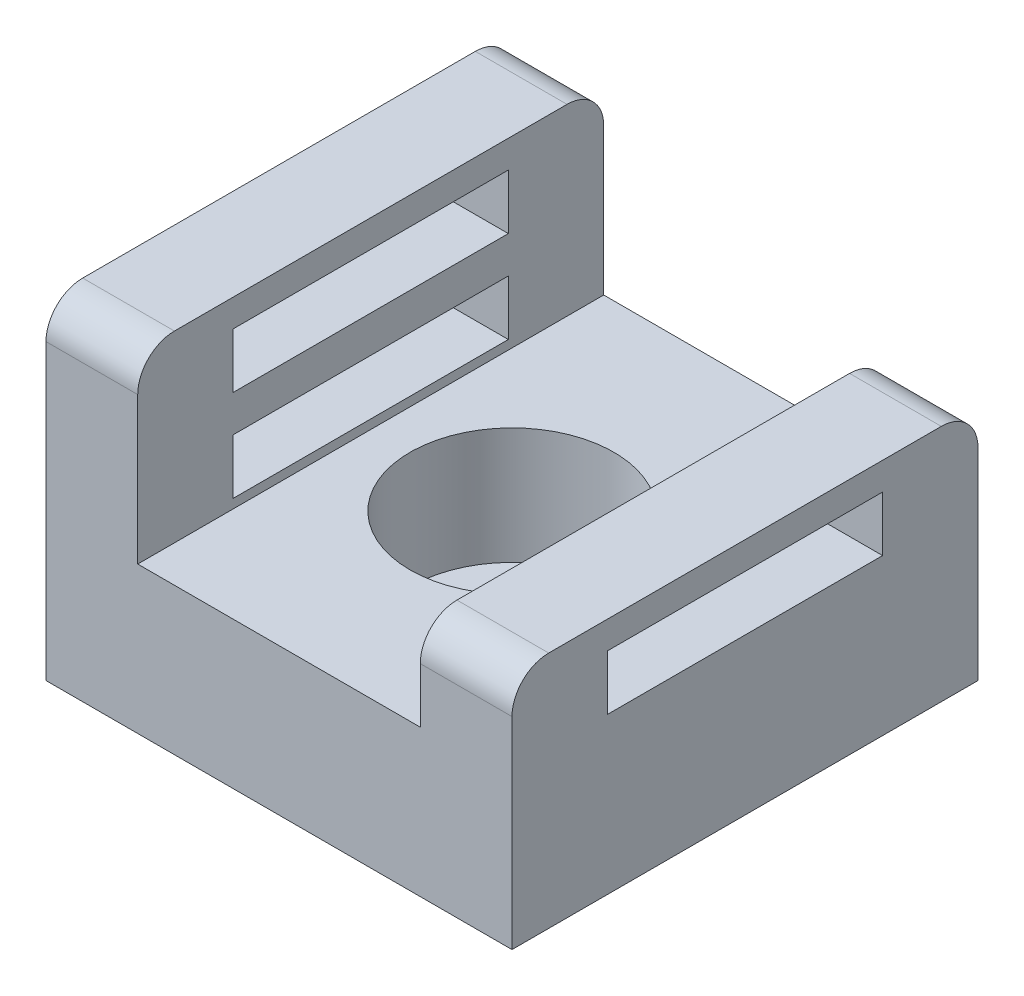
ISO-10303-21;
HEADER;
FILE_DESCRIPTION(('STEP AP214'),'2;1');
FILE_NAME('part.step','',(''),(''),'','','');
FILE_SCHEMA(('AUTOMOTIVE_DESIGN { 1 0 10303 214 1 1 1 1 }'));
ENDSEC;
DATA;
#1=APPLICATION_CONTEXT('core data for automotive mechanical design processes');
#2=APPLICATION_PROTOCOL_DEFINITION('international standard','automotive_design',2000,#1);
#3=PRODUCT_CONTEXT('',#1,'mechanical');
#4=PRODUCT('Part','Part','',(#3));
#5=PRODUCT_RELATED_PRODUCT_CATEGORY('part','',(#4));
#6=PRODUCT_DEFINITION_FORMATION('','',#4);
#7=PRODUCT_DEFINITION_CONTEXT('part definition',#1,'design');
#8=PRODUCT_DEFINITION('design','',#6,#7);
#9=PRODUCT_DEFINITION_SHAPE('','',#8);
#10=(LENGTH_UNIT() NAMED_UNIT(*) SI_UNIT(.MILLI.,.METRE.));
#11=(NAMED_UNIT(*) PLANE_ANGLE_UNIT() SI_UNIT($,.RADIAN.));
#12=(NAMED_UNIT(*) SI_UNIT($,.STERADIAN.) SOLID_ANGLE_UNIT());
#13=UNCERTAINTY_MEASURE_WITH_UNIT(LENGTH_MEASURE(1.E-05),#10,'distance_accuracy_value','');
#14=(GEOMETRIC_REPRESENTATION_CONTEXT(3) GLOBAL_UNCERTAINTY_ASSIGNED_CONTEXT((#13)) GLOBAL_UNIT_ASSIGNED_CONTEXT((#10,
#11,#12)) REPRESENTATION_CONTEXT('',''));
#15=CARTESIAN_POINT('',(0.,0.,0.));
#16=DIRECTION('',(0.,0.,1.));
#17=DIRECTION('',(1.,0.,0.));
#18=AXIS2_PLACEMENT_3D('',#15,#16,#17);
#19=CARTESIAN_POINT('',(0.,8.,0.));
#20=DIRECTION('',(0.,1.,0.));
#21=DIRECTION('',(0.,0.,1.));
#22=AXIS2_PLACEMENT_3D('',#19,#20,#21);
#23=PLANE('',#22);
#24=CARTESIAN_POINT('',(2.02813688212928,8.,7.89524714828898));
#25=DIRECTION('',(0.,1.,0.));
#26=DIRECTION('',(0.,0.,1.));
#27=AXIS2_PLACEMENT_3D('',#24,#25,#26);
#28=CIRCLE('',#27,5.55625);
#29=CARTESIAN_POINT('',(2.02813688212928,8.,13.451497148289));
#30=VERTEX_POINT('',#29);
#31=EDGE_CURVE('E285',#30,#30,#28,.T.);
#32=ORIENTED_EDGE('',*,*,#31,.F.);
#33=EDGE_LOOP('',(#32));
#34=FACE_BOUND('',#33,.T.);
#35=DIRECTION('',(1.,0.,0.));
#36=VECTOR('',#35,1.);
#37=CARTESIAN_POINT('',(-10.6718631178707,8.,20.595247148289));
#38=LINE('',#37,#36);
#39=CARTESIAN_POINT('',(-5.67186311787072,8.,20.595247148289));
#40=VERTEX_POINT('',#39);
#41=CARTESIAN_POINT('',(9.72813688212928,8.,20.595247148289));
#42=VERTEX_POINT('',#41);
#43=EDGE_CURVE('E317',#40,#42,#38,.T.);
#44=ORIENTED_EDGE('',*,*,#43,.T.);
#45=DIRECTION('',(0.,0.,1.));
#46=VECTOR('',#45,1.);
#47=CARTESIAN_POINT('',(9.72813688212927,8.,-4.80475285171102));
#48=LINE('',#47,#46);
#49=CARTESIAN_POINT('',(9.72813688212928,8.,-4.80475285171102));
#50=VERTEX_POINT('',#49);
#51=EDGE_CURVE('E297',#50,#42,#48,.T.);
#52=ORIENTED_EDGE('',*,*,#51,.F.);
#53=DIRECTION('',(-1.,0.,0.));
#54=VECTOR('',#53,1.);
#55=CARTESIAN_POINT('',(-10.6718631178707,8.,-4.80475285171102));
#56=LINE('',#55,#54);
#57=CARTESIAN_POINT('',(-5.67186311787072,8.,-4.80475285171102));
#58=VERTEX_POINT('',#57);
#59=EDGE_CURVE('E320',#50,#58,#56,.T.);
#60=ORIENTED_EDGE('',*,*,#59,.T.);
#61=DIRECTION('',(0.,0.,-1.));
#62=VECTOR('',#61,1.);
#63=CARTESIAN_POINT('',(-5.67186311787072,8.,-4.80475285171102));
#64=LINE('',#63,#62);
#65=EDGE_CURVE('E309',#40,#58,#64,.T.);
#66=ORIENTED_EDGE('',*,*,#65,.F.);
#67=EDGE_LOOP('',(#44,#52,#60,#66));
#68=FACE_BOUND('',#67,.T.);
#69=ADVANCED_FACE('F33',(#34,#68),#23,.T.);
#70=CARTESIAN_POINT('',(-10.6718631178707,8.,-4.80475285171102));
#71=DIRECTION('',(1.,0.,0.));
#72=DIRECTION('',(0.,0.,-1.));
#73=AXIS2_PLACEMENT_3D('',#70,#71,#72);
#74=PLANE('',#73);
#75=DIRECTION('',(0.,0.,1.));
#76=VECTOR('',#75,1.);
#77=CARTESIAN_POINT('',(-10.6718631178707,13.5,0.395247148288981));
#78=LINE('',#77,#76);
#79=CARTESIAN_POINT('',(-10.6718631178707,13.5,0.395247148288978));
#80=VERTEX_POINT('',#79);
#81=CARTESIAN_POINT('',(-10.6718631178707,13.5,15.395247148289));
#82=VERTEX_POINT('',#81);
#83=EDGE_CURVE('E210',#80,#82,#78,.T.);
#84=ORIENTED_EDGE('',*,*,#83,.F.);
#85=DIRECTION('',(0.,-1.,0.));
#86=VECTOR('',#85,1.);
#87=CARTESIAN_POINT('',(-10.6718631178707,16.5,0.395247148288981));
#88=LINE('',#87,#86);
#89=CARTESIAN_POINT('',(-10.6718631178707,16.5,0.395247148288981));
#90=VERTEX_POINT('',#89);
#91=EDGE_CURVE('E215',#90,#80,#88,.T.);
#92=ORIENTED_EDGE('',*,*,#91,.F.);
#93=DIRECTION('',(0.,0.,-1.));
#94=VECTOR('',#93,1.);
#95=CARTESIAN_POINT('',(-10.6718631178707,16.5,0.395247148288981));
#96=LINE('',#95,#94);
#97=CARTESIAN_POINT('',(-10.6718631178707,16.5,15.395247148289));
#98=VERTEX_POINT('',#97);
#99=EDGE_CURVE('E220',#98,#90,#96,.T.);
#100=ORIENTED_EDGE('',*,*,#99,.F.);
#101=DIRECTION('',(0.,1.,0.));
#102=VECTOR('',#101,1.);
#103=CARTESIAN_POINT('',(-10.6718631178707,16.5,15.395247148289));
#104=LINE('',#103,#102);
#105=EDGE_CURVE('E199',#82,#98,#104,.T.);
#106=ORIENTED_EDGE('',*,*,#105,.F.);
#107=EDGE_LOOP('',(#84,#92,#100,#106));
#108=FACE_BOUND('',#107,.T.);
#109=DIRECTION('',(0.,0.,1.));
#110=VECTOR('',#109,1.);
#111=CARTESIAN_POINT('',(-10.6718631178707,8.5,15.395247148289));
#112=LINE('',#111,#110);
#113=CARTESIAN_POINT('',(-10.6718631178707,8.5,0.395247148288972));
#114=VERTEX_POINT('',#113);
#115=CARTESIAN_POINT('',(-10.6718631178707,8.5,15.395247148289));
#116=VERTEX_POINT('',#115);
#117=EDGE_CURVE('E251',#114,#116,#112,.T.);
#118=ORIENTED_EDGE('',*,*,#117,.F.);
#119=DIRECTION('',(0.,-1.,0.));
#120=VECTOR('',#119,1.);
#121=CARTESIAN_POINT('',(-10.6718631178707,8.5,0.395247148288976));
#122=LINE('',#121,#120);
#123=CARTESIAN_POINT('',(-10.6718631178707,11.5,0.395247148288976));
#124=VERTEX_POINT('',#123);
#125=EDGE_CURVE('E235',#124,#114,#122,.T.);
#126=ORIENTED_EDGE('',*,*,#125,.F.);
#127=DIRECTION('',(0.,0.,-1.));
#128=VECTOR('',#127,1.);
#129=CARTESIAN_POINT('',(-10.6718631178707,11.5,15.395247148289));
#130=LINE('',#129,#128);
#131=CARTESIAN_POINT('',(-10.6718631178707,11.5,15.395247148289));
#132=VERTEX_POINT('',#131);
#133=EDGE_CURVE('E240',#132,#124,#130,.T.);
#134=ORIENTED_EDGE('',*,*,#133,.F.);
#135=DIRECTION('',(0.,1.,0.));
#136=VECTOR('',#135,1.);
#137=CARTESIAN_POINT('',(-10.6718631178707,8.5,15.395247148289));
#138=LINE('',#137,#136);
#139=EDGE_CURVE('E254',#116,#132,#138,.T.);
#140=ORIENTED_EDGE('',*,*,#139,.F.);
#141=EDGE_LOOP('',(#118,#126,#134,#140));
#142=FACE_BOUND('',#141,.T.);
#143=DIRECTION('',(0.,0.,1.));
#144=VECTOR('',#143,1.);
#145=CARTESIAN_POINT('',(-10.6718631178707,18.,20.595247148289));
#146=LINE('',#145,#144);
#147=CARTESIAN_POINT('',(-10.6718631178707,18.,-2.80475285171102));
#148=VERTEX_POINT('',#147);
#149=CARTESIAN_POINT('',(-10.6718631178707,18.,18.595247148289));
#150=VERTEX_POINT('',#149);
#151=EDGE_CURVE('E232',#148,#150,#146,.T.);
#152=ORIENTED_EDGE('',*,*,#151,.F.);
#153=CARTESIAN_POINT('',(-10.6718631178707,16.,-2.80475285171102));
#154=DIRECTION('',(1.,0.,0.));
#155=DIRECTION('',(0.,0.,-1.));
#156=AXIS2_PLACEMENT_3D('',#153,#154,#155);
#157=CIRCLE('',#156,2.);
#158=CARTESIAN_POINT('',(-10.6718631178707,16.,-4.80475285171102));
#159=VERTEX_POINT('',#158);
#160=EDGE_CURVE('E371',#148,#159,#157,.F.);
#161=ORIENTED_EDGE('',*,*,#160,.T.);
#162=DIRECTION('',(0.,-1.,0.));
#163=VECTOR('',#162,1.);
#164=CARTESIAN_POINT('',(-10.6718631178707,8.,-4.80475285171102));
#165=LINE('',#164,#163);
#166=CARTESIAN_POINT('',(-10.6718631178707,0.,-4.80475285171102));
#167=VERTEX_POINT('',#166);
#168=EDGE_CURVE('E324',#159,#167,#165,.T.);
#169=ORIENTED_EDGE('',*,*,#168,.T.);
#170=DIRECTION('',(0.,0.,1.));
#171=VECTOR('',#170,1.);
#172=CARTESIAN_POINT('',(-10.6718631178707,0.,-4.80475285171102));
#173=LINE('',#172,#171);
#174=CARTESIAN_POINT('',(-10.6718631178707,0.,20.595247148289));
#175=VERTEX_POINT('',#174);
#176=EDGE_CURVE('E316',#167,#175,#173,.T.);
#177=ORIENTED_EDGE('',*,*,#176,.T.);
#178=DIRECTION('',(0.,-1.,0.));
#179=VECTOR('',#178,1.);
#180=CARTESIAN_POINT('',(-10.6718631178707,8.,20.595247148289));
#181=LINE('',#180,#179);
#182=CARTESIAN_POINT('',(-10.6718631178707,16.,20.595247148289));
#183=VERTEX_POINT('',#182);
#184=EDGE_CURVE('E340',#183,#175,#181,.T.);
#185=ORIENTED_EDGE('',*,*,#184,.F.);
#186=CARTESIAN_POINT('',(-10.6718631178707,16.,18.595247148289));
#187=DIRECTION('',(1.,0.,0.));
#188=DIRECTION('',(0.,0.,-1.));
#189=AXIS2_PLACEMENT_3D('',#186,#187,#188);
#190=CIRCLE('',#189,2.);
#191=EDGE_CURVE('E369',#183,#150,#190,.F.);
#192=ORIENTED_EDGE('',*,*,#191,.T.);
#193=EDGE_LOOP('',(#152,#161,#169,#177,#185,#192));
#194=FACE_BOUND('',#193,.T.);
#195=ADVANCED_FACE('F217',(#108,#142,#194),#74,.F.);
#196=CARTESIAN_POINT('',(-10.6718631178707,8.,20.595247148289));
#197=DIRECTION('',(0.,0.,-1.));
#198=DIRECTION('',(-1.,0.,0.));
#199=AXIS2_PLACEMENT_3D('',#196,#197,#198);
#200=PLANE('',#199);
#201=DIRECTION('',(0.,-1.,0.));
#202=VECTOR('',#201,1.);
#203=CARTESIAN_POINT('',(-5.67186311787072,13.,20.595247148289));
#204=LINE('',#203,#202);
#205=CARTESIAN_POINT('',(-5.67186311787072,16.,20.595247148289));
#206=VERTEX_POINT('',#205);
#207=EDGE_CURVE('E314',#206,#40,#204,.T.);
#208=ORIENTED_EDGE('',*,*,#207,.F.);
#209=DIRECTION('',(1.,0.,0.));
#210=VECTOR('',#209,1.);
#211=CARTESIAN_POINT('',(-10.6718631178707,16.,20.595247148289));
#212=LINE('',#211,#210);
#213=EDGE_CURVE('E383',#206,#183,#212,.F.);
#214=ORIENTED_EDGE('',*,*,#213,.T.);
#215=ORIENTED_EDGE('',*,*,#184,.T.);
#216=DIRECTION('',(1.,0.,0.));
#217=VECTOR('',#216,1.);
#218=CARTESIAN_POINT('',(-10.6718631178707,0.,20.595247148289));
#219=LINE('',#218,#217);
#220=CARTESIAN_POINT('',(14.7281368821293,0.,20.595247148289));
#221=VERTEX_POINT('',#220);
#222=EDGE_CURVE('E327',#175,#221,#219,.T.);
#223=ORIENTED_EDGE('',*,*,#222,.T.);
#224=DIRECTION('',(0.,-1.,0.));
#225=VECTOR('',#224,1.);
#226=CARTESIAN_POINT('',(14.7281368821293,8.,20.595247148289));
#227=LINE('',#226,#225);
#228=CARTESIAN_POINT('',(14.7281368821293,11.,20.595247148289));
#229=VERTEX_POINT('',#228);
#230=EDGE_CURVE('E338',#229,#221,#227,.T.);
#231=ORIENTED_EDGE('',*,*,#230,.F.);
#232=DIRECTION('',(1.,0.,0.));
#233=VECTOR('',#232,1.);
#234=CARTESIAN_POINT('',(-10.6718631178707,11.,20.595247148289));
#235=LINE('',#234,#233);
#236=CARTESIAN_POINT('',(9.72813688212928,11.,20.595247148289));
#237=VERTEX_POINT('',#236);
#238=EDGE_CURVE('E381',#229,#237,#235,.F.);
#239=ORIENTED_EDGE('',*,*,#238,.T.);
#240=DIRECTION('',(0.,-1.,0.));
#241=VECTOR('',#240,1.);
#242=CARTESIAN_POINT('',(9.72813688212928,13.,20.595247148289));
#243=LINE('',#242,#241);
#244=EDGE_CURVE('E303',#237,#42,#243,.T.);
#245=ORIENTED_EDGE('',*,*,#244,.T.);
#246=ORIENTED_EDGE('',*,*,#43,.F.);
#247=EDGE_LOOP('',(#208,#214,#215,#223,#231,#239,#245,#246));
#248=FACE_BOUND('',#247,.T.);
#249=ADVANCED_FACE('F414',(#248),#200,.F.);
#250=CARTESIAN_POINT('',(14.7281368821293,8.,-4.80475285171102));
#251=DIRECTION('',(-1.,0.,0.));
#252=DIRECTION('',(0.,0.,1.));
#253=AXIS2_PLACEMENT_3D('',#250,#251,#252);
#254=PLANE('',#253);
#255=DIRECTION('',(0.,0.,-1.));
#256=VECTOR('',#255,1.);
#257=CARTESIAN_POINT('',(14.7281368821293,11.5,15.395247148289));
#258=LINE('',#257,#256);
#259=CARTESIAN_POINT('',(14.7281368821293,11.5,15.395247148289));
#260=VERTEX_POINT('',#259);
#261=CARTESIAN_POINT('',(14.7281368821293,11.5,0.395247148288972));
#262=VERTEX_POINT('',#261);
#263=EDGE_CURVE('E246',#260,#262,#258,.T.);
#264=ORIENTED_EDGE('',*,*,#263,.T.);
#265=DIRECTION('',(0.,-1.,0.));
#266=VECTOR('',#265,1.);
#267=CARTESIAN_POINT('',(14.7281368821293,8.5,0.395247148288972));
#268=LINE('',#267,#266);
#269=CARTESIAN_POINT('',(14.7281368821293,8.5,0.395247148288972));
#270=VERTEX_POINT('',#269);
#271=EDGE_CURVE('E236',#262,#270,#268,.T.);
#272=ORIENTED_EDGE('',*,*,#271,.T.);
#273=DIRECTION('',(0.,0.,1.));
#274=VECTOR('',#273,1.);
#275=CARTESIAN_POINT('',(14.7281368821293,8.5,15.395247148289));
#276=LINE('',#275,#274);
#277=CARTESIAN_POINT('',(14.7281368821293,8.5,15.395247148289));
#278=VERTEX_POINT('',#277);
#279=EDGE_CURVE('E239',#270,#278,#276,.T.);
#280=ORIENTED_EDGE('',*,*,#279,.T.);
#281=DIRECTION('',(0.,1.,0.));
#282=VECTOR('',#281,1.);
#283=CARTESIAN_POINT('',(14.7281368821293,8.5,15.395247148289));
#284=LINE('',#283,#282);
#285=EDGE_CURVE('E243',#278,#260,#284,.T.);
#286=ORIENTED_EDGE('',*,*,#285,.T.);
#287=EDGE_LOOP('',(#264,#272,#280,#286));
#288=FACE_BOUND('',#287,.T.);
#289=DIRECTION('',(0.,0.,-1.));
#290=VECTOR('',#289,1.);
#291=CARTESIAN_POINT('',(14.7281368821293,13.,-4.80475285171102));
#292=LINE('',#291,#290);
#293=CARTESIAN_POINT('',(14.7281368821293,13.,18.595247148289));
#294=VERTEX_POINT('',#293);
#295=CARTESIAN_POINT('',(14.7281368821293,13.,-2.80475285171102));
#296=VERTEX_POINT('',#295);
#297=EDGE_CURVE('E298',#294,#296,#292,.T.);
#298=ORIENTED_EDGE('',*,*,#297,.F.);
#299=CARTESIAN_POINT('',(14.7281368821293,11.,18.595247148289));
#300=DIRECTION('',(-1.,0.,0.));
#301=DIRECTION('',(0.,0.,1.));
#302=AXIS2_PLACEMENT_3D('',#299,#300,#301);
#303=CIRCLE('',#302,2.);
#304=EDGE_CURVE('E392',#294,#229,#303,.F.);
#305=ORIENTED_EDGE('',*,*,#304,.T.);
#306=ORIENTED_EDGE('',*,*,#230,.T.);
#307=DIRECTION('',(0.,0.,-1.));
#308=VECTOR('',#307,1.);
#309=CARTESIAN_POINT('',(14.7281368821293,0.,-4.80475285171102));
#310=LINE('',#309,#308);
#311=CARTESIAN_POINT('',(14.7281368821293,0.,-4.80475285171102));
#312=VERTEX_POINT('',#311);
#313=EDGE_CURVE('E330',#221,#312,#310,.T.);
#314=ORIENTED_EDGE('',*,*,#313,.T.);
#315=DIRECTION('',(0.,-1.,0.));
#316=VECTOR('',#315,1.);
#317=CARTESIAN_POINT('',(14.7281368821293,8.,-4.80475285171102));
#318=LINE('',#317,#316);
#319=CARTESIAN_POINT('',(14.7281368821293,11.,-4.80475285171102));
#320=VERTEX_POINT('',#319);
#321=EDGE_CURVE('E336',#320,#312,#318,.T.);
#322=ORIENTED_EDGE('',*,*,#321,.F.);
#323=CARTESIAN_POINT('',(14.7281368821293,11.,-2.80475285171102));
#324=DIRECTION('',(-1.,0.,0.));
#325=DIRECTION('',(0.,0.,1.));
#326=AXIS2_PLACEMENT_3D('',#323,#324,#325);
#327=CIRCLE('',#326,2.);
#328=EDGE_CURVE('E390',#320,#296,#327,.F.);
#329=ORIENTED_EDGE('',*,*,#328,.T.);
#330=EDGE_LOOP('',(#298,#305,#306,#314,#322,#329));
#331=FACE_BOUND('',#330,.T.);
#332=ADVANCED_FACE('F404',(#288,#331),#254,.F.);
#333=CARTESIAN_POINT('',(-10.6718631178707,8.,-4.80475285171102));
#334=DIRECTION('',(0.,0.,1.));
#335=DIRECTION('',(1.,0.,0.));
#336=AXIS2_PLACEMENT_3D('',#333,#334,#335);
#337=PLANE('',#336);
#338=ORIENTED_EDGE('',*,*,#168,.F.);
#339=DIRECTION('',(-1.,0.,0.));
#340=VECTOR('',#339,1.);
#341=CARTESIAN_POINT('',(-5.67186311787072,16.,-4.80475285171102));
#342=LINE('',#341,#340);
#343=CARTESIAN_POINT('',(-5.67186311787072,16.,-4.80475285171102));
#344=VERTEX_POINT('',#343);
#345=EDGE_CURVE('E375',#159,#344,#342,.F.);
#346=ORIENTED_EDGE('',*,*,#345,.T.);
#347=DIRECTION('',(0.,-1.,0.));
#348=VECTOR('',#347,1.);
#349=CARTESIAN_POINT('',(-5.67186311787072,13.,-4.80475285171102));
#350=LINE('',#349,#348);
#351=EDGE_CURVE('E312',#344,#58,#350,.T.);
#352=ORIENTED_EDGE('',*,*,#351,.T.);
#353=ORIENTED_EDGE('',*,*,#59,.F.);
#354=DIRECTION('',(0.,-1.,0.));
#355=VECTOR('',#354,1.);
#356=CARTESIAN_POINT('',(9.72813688212927,13.,-4.80475285171102));
#357=LINE('',#356,#355);
#358=CARTESIAN_POINT('',(9.72813688212927,11.,-4.80475285171102));
#359=VERTEX_POINT('',#358);
#360=EDGE_CURVE('E307',#359,#50,#357,.T.);
#361=ORIENTED_EDGE('',*,*,#360,.F.);
#362=DIRECTION('',(-1.,0.,0.));
#363=VECTOR('',#362,1.);
#364=CARTESIAN_POINT('',(-10.6718631178707,11.,-4.80475285171102));
#365=LINE('',#364,#363);
#366=EDGE_CURVE('E373',#359,#320,#365,.F.);
#367=ORIENTED_EDGE('',*,*,#366,.T.);
#368=ORIENTED_EDGE('',*,*,#321,.T.);
#369=DIRECTION('',(-1.,0.,0.));
#370=VECTOR('',#369,1.);
#371=CARTESIAN_POINT('',(-10.6718631178707,0.,-4.80475285171102));
#372=LINE('',#371,#370);
#373=EDGE_CURVE('E321',#312,#167,#372,.T.);
#374=ORIENTED_EDGE('',*,*,#373,.T.);
#375=EDGE_LOOP('',(#338,#346,#352,#353,#361,#367,#368,#374));
#376=FACE_BOUND('',#375,.T.);
#377=ADVANCED_FACE('F399',(#376),#337,.F.);
#378=CARTESIAN_POINT('',(0.,0.,0.));
#379=DIRECTION('',(0.,1.,0.));
#380=DIRECTION('',(0.,0.,1.));
#381=AXIS2_PLACEMENT_3D('',#378,#379,#380);
#382=PLANE('',#381);
#383=CARTESIAN_POINT('',(2.02813688212928,0.,7.89524714828898));
#384=DIRECTION('',(0.,1.,0.));
#385=DIRECTION('',(0.,0.,1.));
#386=AXIS2_PLACEMENT_3D('',#383,#384,#385);
#387=CIRCLE('',#386,3.3782);
#388=CARTESIAN_POINT('',(2.02813688212928,0.,11.273447148289));
#389=VERTEX_POINT('',#388);
#390=EDGE_CURVE('E294',#389,#389,#387,.T.);
#391=ORIENTED_EDGE('',*,*,#390,.T.);
#392=EDGE_LOOP('',(#391));
#393=FACE_BOUND('',#392,.T.);
#394=ORIENTED_EDGE('',*,*,#176,.F.);
#395=ORIENTED_EDGE('',*,*,#373,.F.);
#396=ORIENTED_EDGE('',*,*,#313,.F.);
#397=ORIENTED_EDGE('',*,*,#222,.F.);
#398=EDGE_LOOP('',(#394,#395,#396,#397));
#399=FACE_BOUND('',#398,.T.);
#400=ADVANCED_FACE('F421',(#393,#399),#382,.F.);
#401=CARTESIAN_POINT('',(-5.67186311787072,13.,-4.80475285171102));
#402=DIRECTION('',(-1.,0.,0.));
#403=DIRECTION('',(0.,0.,1.));
#404=AXIS2_PLACEMENT_3D('',#401,#402,#403);
#405=PLANE('',#404);
#406=DIRECTION('',(0.,0.,-1.));
#407=VECTOR('',#406,1.);
#408=CARTESIAN_POINT('',(-5.67186311787072,16.5,-4.80475285171102));
#409=LINE('',#408,#407);
#410=CARTESIAN_POINT('',(-5.67186311787072,16.5,15.395247148289));
#411=VERTEX_POINT('',#410);
#412=CARTESIAN_POINT('',(-5.67186311787072,16.5,0.39524714828898));
#413=VERTEX_POINT('',#412);
#414=EDGE_CURVE('E357',#411,#413,#409,.T.);
#415=ORIENTED_EDGE('',*,*,#414,.T.);
#416=DIRECTION('',(0.,-1.,0.));
#417=VECTOR('',#416,1.);
#418=CARTESIAN_POINT('',(-5.67186311787072,13.,0.395247148288981));
#419=LINE('',#418,#417);
#420=CARTESIAN_POINT('',(-5.67186311787072,13.5,0.395247148288981));
#421=VERTEX_POINT('',#420);
#422=EDGE_CURVE('E360',#413,#421,#419,.T.);
#423=ORIENTED_EDGE('',*,*,#422,.T.);
#424=DIRECTION('',(0.,0.,1.));
#425=VECTOR('',#424,1.);
#426=CARTESIAN_POINT('',(-5.67186311787072,13.5,-4.80475285171102));
#427=LINE('',#426,#425);
#428=CARTESIAN_POINT('',(-5.67186311787072,13.5,15.395247148289));
#429=VERTEX_POINT('',#428);
#430=EDGE_CURVE('E354',#421,#429,#427,.T.);
#431=ORIENTED_EDGE('',*,*,#430,.T.);
#432=DIRECTION('',(0.,1.,0.));
#433=VECTOR('',#432,1.);
#434=CARTESIAN_POINT('',(-5.67186311787072,13.,15.395247148289));
#435=LINE('',#434,#433);
#436=EDGE_CURVE('E202',#429,#411,#435,.T.);
#437=ORIENTED_EDGE('',*,*,#436,.T.);
#438=EDGE_LOOP('',(#415,#423,#431,#437));
#439=FACE_BOUND('',#438,.T.);
#440=DIRECTION('',(0.,0.,-1.));
#441=VECTOR('',#440,1.);
#442=CARTESIAN_POINT('',(-5.67186311787072,11.5,-4.80475285171102));
#443=LINE('',#442,#441);
#444=CARTESIAN_POINT('',(-5.67186311787072,11.5,15.395247148289));
#445=VERTEX_POINT('',#444);
#446=CARTESIAN_POINT('',(-5.67186311787072,11.5,0.395247148288975));
#447=VERTEX_POINT('',#446);
#448=EDGE_CURVE('E279',#445,#447,#443,.T.);
#449=ORIENTED_EDGE('',*,*,#448,.T.);
#450=DIRECTION('',(0.,-1.,0.));
#451=VECTOR('',#450,1.);
#452=CARTESIAN_POINT('',(-5.67186311787072,13.,0.395247148288975));
#453=LINE('',#452,#451);
#454=CARTESIAN_POINT('',(-5.67186311787072,8.5,0.395247148288975));
#455=VERTEX_POINT('',#454);
#456=EDGE_CURVE('E282',#447,#455,#453,.T.);
#457=ORIENTED_EDGE('',*,*,#456,.T.);
#458=DIRECTION('',(0.,0.,1.));
#459=VECTOR('',#458,1.);
#460=CARTESIAN_POINT('',(-5.67186311787072,8.5,-4.80475285171102));
#461=LINE('',#460,#459);
#462=CARTESIAN_POINT('',(-5.67186311787072,8.5,15.395247148289));
#463=VERTEX_POINT('',#462);
#464=EDGE_CURVE('E262',#455,#463,#461,.T.);
#465=ORIENTED_EDGE('',*,*,#464,.T.);
#466=DIRECTION('',(0.,1.,0.));
#467=VECTOR('',#466,1.);
#468=CARTESIAN_POINT('',(-5.67186311787072,13.,15.395247148289));
#469=LINE('',#468,#467);
#470=EDGE_CURVE('E276',#463,#445,#469,.T.);
#471=ORIENTED_EDGE('',*,*,#470,.T.);
#472=EDGE_LOOP('',(#449,#457,#465,#471));
#473=FACE_BOUND('',#472,.T.);
#474=ORIENTED_EDGE('',*,*,#351,.F.);
#475=CARTESIAN_POINT('',(-5.67186311787072,16.,-2.80475285171102));
#476=DIRECTION('',(-1.,0.,0.));
#477=DIRECTION('',(0.,0.,1.));
#478=AXIS2_PLACEMENT_3D('',#475,#476,#477);
#479=CIRCLE('',#478,2.);
#480=CARTESIAN_POINT('',(-5.67186311787072,18.,-2.80475285171102));
#481=VERTEX_POINT('',#480);
#482=EDGE_CURVE('E379',#344,#481,#479,.F.);
#483=ORIENTED_EDGE('',*,*,#482,.T.);
#484=DIRECTION('',(0.,0.,-1.));
#485=VECTOR('',#484,1.);
#486=CARTESIAN_POINT('',(-5.67186311787072,18.,20.595247148289));
#487=LINE('',#486,#485);
#488=CARTESIAN_POINT('',(-5.67186311787072,18.,18.595247148289));
#489=VERTEX_POINT('',#488);
#490=EDGE_CURVE('E227',#489,#481,#487,.T.);
#491=ORIENTED_EDGE('',*,*,#490,.F.);
#492=CARTESIAN_POINT('',(-5.67186311787072,16.,18.595247148289));
#493=DIRECTION('',(-1.,0.,0.));
#494=DIRECTION('',(0.,0.,1.));
#495=AXIS2_PLACEMENT_3D('',#492,#493,#494);
#496=CIRCLE('',#495,2.);
#497=EDGE_CURVE('E377',#489,#206,#496,.F.);
#498=ORIENTED_EDGE('',*,*,#497,.T.);
#499=ORIENTED_EDGE('',*,*,#207,.T.);
#500=ORIENTED_EDGE('',*,*,#65,.T.);
#501=EDGE_LOOP('',(#474,#483,#491,#498,#499,#500));
#502=FACE_BOUND('',#501,.T.);
#503=ADVANCED_FACE('F431',(#439,#473,#502),#405,.F.);
#504=CARTESIAN_POINT('',(9.72813688212927,13.,-4.80475285171102));
#505=DIRECTION('',(1.,0.,0.));
#506=DIRECTION('',(0.,0.,-1.));
#507=AXIS2_PLACEMENT_3D('',#504,#505,#506);
#508=PLANE('',#507);
#509=DIRECTION('',(0.,0.,-1.));
#510=VECTOR('',#509,1.);
#511=CARTESIAN_POINT('',(9.72813688212927,8.5,-4.80475285171102));
#512=LINE('',#511,#510);
#513=CARTESIAN_POINT('',(9.72813688212928,8.5,15.395247148289));
#514=VERTEX_POINT('',#513);
#515=CARTESIAN_POINT('',(9.72813688212927,8.5,0.395247148288972));
#516=VERTEX_POINT('',#515);
#517=EDGE_CURVE('E342',#514,#516,#512,.T.);
#518=ORIENTED_EDGE('',*,*,#517,.T.);
#519=DIRECTION('',(0.,1.,0.));
#520=VECTOR('',#519,1.);
#521=CARTESIAN_POINT('',(9.72813688212927,13.,0.395247148288974));
#522=LINE('',#521,#520);
#523=CARTESIAN_POINT('',(9.72813688212928,11.5,0.395247148288973));
#524=VERTEX_POINT('',#523);
#525=EDGE_CURVE('E351',#516,#524,#522,.T.);
#526=ORIENTED_EDGE('',*,*,#525,.T.);
#527=DIRECTION('',(0.,0.,1.));
#528=VECTOR('',#527,1.);
#529=CARTESIAN_POINT('',(9.72813688212927,11.5,-4.80475285171102));
#530=LINE('',#529,#528);
#531=CARTESIAN_POINT('',(9.72813688212928,11.5,15.395247148289));
#532=VERTEX_POINT('',#531);
#533=EDGE_CURVE('E348',#524,#532,#530,.T.);
#534=ORIENTED_EDGE('',*,*,#533,.T.);
#535=DIRECTION('',(0.,-1.,0.));
#536=VECTOR('',#535,1.);
#537=CARTESIAN_POINT('',(9.72813688212928,13.,15.395247148289));
#538=LINE('',#537,#536);
#539=EDGE_CURVE('E345',#532,#514,#538,.T.);
#540=ORIENTED_EDGE('',*,*,#539,.T.);
#541=EDGE_LOOP('',(#518,#526,#534,#540));
#542=FACE_BOUND('',#541,.T.);
#543=ORIENTED_EDGE('',*,*,#244,.F.);
#544=CARTESIAN_POINT('',(9.72813688212928,11.,18.595247148289));
#545=DIRECTION('',(1.,0.,0.));
#546=DIRECTION('',(0.,0.,-1.));
#547=AXIS2_PLACEMENT_3D('',#544,#545,#546);
#548=CIRCLE('',#547,2.);
#549=CARTESIAN_POINT('',(9.72813688212928,13.,18.595247148289));
#550=VERTEX_POINT('',#549);
#551=EDGE_CURVE('E11',#237,#550,#548,.F.);
#552=ORIENTED_EDGE('',*,*,#551,.T.);
#553=DIRECTION('',(0.,0.,1.));
#554=VECTOR('',#553,1.);
#555=CARTESIAN_POINT('',(9.72813688212927,13.,-4.80475285171102));
#556=LINE('',#555,#554);
#557=CARTESIAN_POINT('',(9.72813688212927,13.,-2.80475285171102));
#558=VERTEX_POINT('',#557);
#559=EDGE_CURVE('E301',#558,#550,#556,.T.);
#560=ORIENTED_EDGE('',*,*,#559,.F.);
#561=CARTESIAN_POINT('',(9.72813688212927,11.,-2.80475285171102));
#562=DIRECTION('',(1.,0.,0.));
#563=DIRECTION('',(0.,0.,-1.));
#564=AXIS2_PLACEMENT_3D('',#561,#562,#563);
#565=CIRCLE('',#564,2.);
#566=EDGE_CURVE('E41',#558,#359,#565,.F.);
#567=ORIENTED_EDGE('',*,*,#566,.T.);
#568=ORIENTED_EDGE('',*,*,#360,.T.);
#569=ORIENTED_EDGE('',*,*,#51,.T.);
#570=EDGE_LOOP('',(#543,#552,#560,#567,#568,#569));
#571=FACE_BOUND('',#570,.T.);
#572=ADVANCED_FACE('F394',(#542,#571),#508,.F.);
#573=CARTESIAN_POINT('',(0.,13.,0.));
#574=DIRECTION('',(0.,-1.,0.));
#575=DIRECTION('',(0.,0.,-1.));
#576=AXIS2_PLACEMENT_3D('',#573,#574,#575);
#577=PLANE('',#576);
#578=ORIENTED_EDGE('',*,*,#559,.T.);
#579=DIRECTION('',(1.,0.,0.));
#580=VECTOR('',#579,1.);
#581=CARTESIAN_POINT('',(0.,13.,18.595247148289));
#582=LINE('',#581,#580);
#583=EDGE_CURVE('E387',#550,#294,#582,.T.);
#584=ORIENTED_EDGE('',*,*,#583,.T.);
#585=ORIENTED_EDGE('',*,*,#297,.T.);
#586=DIRECTION('',(-1.,0.,0.));
#587=VECTOR('',#586,1.);
#588=CARTESIAN_POINT('',(0.,13.,-2.80475285171102));
#589=LINE('',#588,#587);
#590=EDGE_CURVE('E385',#296,#558,#589,.T.);
#591=ORIENTED_EDGE('',*,*,#590,.T.);
#592=EDGE_LOOP('',(#578,#584,#585,#591));
#593=FACE_BOUND('',#592,.T.);
#594=ADVANCED_FACE('F406',(#593),#577,.F.);
#595=CARTESIAN_POINT('',(2.02813688212928,8.,7.89524714828898));
#596=DIRECTION('',(0.,1.,0.));
#597=DIRECTION('',(0.,0.,1.));
#598=AXIS2_PLACEMENT_3D('',#595,#596,#597);
#599=CYLINDRICAL_SURFACE('',#598,3.3782);
#600=ORIENTED_EDGE('',*,*,#390,.F.);
#601=EDGE_LOOP('',(#600));
#602=FACE_BOUND('',#601,.T.);
#603=CARTESIAN_POINT('',(2.02813688212928,1.65,7.89524714828898));
#604=DIRECTION('',(0.,1.,0.));
#605=DIRECTION('',(0.,0.,1.));
#606=AXIS2_PLACEMENT_3D('',#603,#604,#605);
#607=CIRCLE('',#606,3.3782);
#608=CARTESIAN_POINT('',(2.02813688212928,1.65,11.273447148289));
#609=VERTEX_POINT('',#608);
#610=EDGE_CURVE('E291',#609,#609,#607,.T.);
#611=ORIENTED_EDGE('',*,*,#610,.T.);
#612=EDGE_LOOP('',(#611));
#613=FACE_BOUND('',#612,.T.);
#614=ADVANCED_FACE('F514',(#602,#613),#599,.F.);
#615=CARTESIAN_POINT('',(5.40633688212928,1.65,7.89524714828898));
#616=DIRECTION('',(0.,-1.,0.));
#617=DIRECTION('',(0.,0.,-1.));
#618=AXIS2_PLACEMENT_3D('',#615,#616,#617);
#619=PLANE('',#618);
#620=ORIENTED_EDGE('',*,*,#610,.F.);
#621=EDGE_LOOP('',(#620));
#622=FACE_BOUND('',#621,.T.);
#623=CARTESIAN_POINT('',(2.02813688212928,1.65,7.89524714828898));
#624=DIRECTION('',(0.,1.,0.));
#625=DIRECTION('',(0.,0.,1.));
#626=AXIS2_PLACEMENT_3D('',#623,#624,#625);
#627=CIRCLE('',#626,5.55625);
#628=CARTESIAN_POINT('',(2.02813688212928,1.65,13.451497148289));
#629=VERTEX_POINT('',#628);
#630=EDGE_CURVE('E288',#629,#629,#627,.T.);
#631=ORIENTED_EDGE('',*,*,#630,.T.);
#632=EDGE_LOOP('',(#631));
#633=FACE_BOUND('',#632,.T.);
#634=ADVANCED_FACE('F676',(#622,#633),#619,.F.);
#635=CARTESIAN_POINT('',(2.02813688212928,8.,7.89524714828898));
#636=DIRECTION('',(0.,1.,0.));
#637=DIRECTION('',(0.,0.,1.));
#638=AXIS2_PLACEMENT_3D('',#635,#636,#637);
#639=CYLINDRICAL_SURFACE('',#638,5.55625);
#640=ORIENTED_EDGE('',*,*,#630,.F.);
#641=EDGE_LOOP('',(#640));
#642=FACE_BOUND('',#641,.T.);
#643=ORIENTED_EDGE('',*,*,#31,.T.);
#644=EDGE_LOOP('',(#643));
#645=FACE_BOUND('',#644,.T.);
#646=ADVANCED_FACE('F667',(#642,#645),#639,.F.);
#647=CARTESIAN_POINT('',(14.7281368821293,8.5,15.395247148289));
#648=DIRECTION('',(0.,-1.,0.));
#649=DIRECTION('',(0.,0.,-1.));
#650=AXIS2_PLACEMENT_3D('',#647,#648,#649);
#651=PLANE('',#650);
#652=DIRECTION('',(-1.,0.,0.));
#653=VECTOR('',#652,1.);
#654=CARTESIAN_POINT('',(14.7281368821293,8.5,15.395247148289));
#655=LINE('',#654,#653);
#656=EDGE_CURVE('E268',#278,#514,#655,.T.);
#657=ORIENTED_EDGE('',*,*,#656,.F.);
#658=ORIENTED_EDGE('',*,*,#279,.F.);
#659=DIRECTION('',(-1.,0.,0.));
#660=VECTOR('',#659,1.);
#661=CARTESIAN_POINT('',(14.7281368821293,8.5,0.395247148288972));
#662=LINE('',#661,#660);
#663=EDGE_CURVE('E272',#270,#516,#662,.T.);
#664=ORIENTED_EDGE('',*,*,#663,.T.);
#665=ORIENTED_EDGE('',*,*,#517,.F.);
#666=EDGE_LOOP('',(#657,#658,#664,#665));
#667=FACE_BOUND('',#666,.T.);
#668=ADVANCED_FACE('F603',(#667),#651,.F.);
#669=CARTESIAN_POINT('',(14.7281368821293,8.5,15.395247148289));
#670=DIRECTION('',(0.,0.,1.));
#671=DIRECTION('',(1.,0.,0.));
#672=AXIS2_PLACEMENT_3D('',#669,#670,#671);
#673=PLANE('',#672);
#674=DIRECTION('',(-1.,0.,0.));
#675=VECTOR('',#674,1.);
#676=CARTESIAN_POINT('',(14.7281368821293,11.5,15.395247148289));
#677=LINE('',#676,#675);
#678=EDGE_CURVE('E264',#260,#532,#677,.T.);
#679=ORIENTED_EDGE('',*,*,#678,.F.);
#680=ORIENTED_EDGE('',*,*,#285,.F.);
#681=ORIENTED_EDGE('',*,*,#656,.T.);
#682=ORIENTED_EDGE('',*,*,#539,.F.);
#683=EDGE_LOOP('',(#679,#680,#681,#682));
#684=FACE_BOUND('',#683,.T.);
#685=ADVANCED_FACE('F614',(#684),#673,.F.);
#686=CARTESIAN_POINT('',(14.7281368821293,11.5,15.395247148289));
#687=DIRECTION('',(0.,1.,0.));
#688=DIRECTION('',(0.,0.,1.));
#689=AXIS2_PLACEMENT_3D('',#686,#687,#688);
#690=PLANE('',#689);
#691=DIRECTION('',(-1.,0.,0.));
#692=VECTOR('',#691,1.);
#693=CARTESIAN_POINT('',(14.7281368821293,11.5,0.395247148288972));
#694=LINE('',#693,#692);
#695=EDGE_CURVE('E259',#262,#524,#694,.T.);
#696=ORIENTED_EDGE('',*,*,#695,.F.);
#697=ORIENTED_EDGE('',*,*,#263,.F.);
#698=ORIENTED_EDGE('',*,*,#678,.T.);
#699=ORIENTED_EDGE('',*,*,#533,.F.);
#700=EDGE_LOOP('',(#696,#697,#698,#699));
#701=FACE_BOUND('',#700,.T.);
#702=ADVANCED_FACE('F625',(#701),#690,.F.);
#703=CARTESIAN_POINT('',(14.7281368821293,8.5,0.395247148288972));
#704=DIRECTION('',(0.,0.,-1.));
#705=DIRECTION('',(-1.,0.,0.));
#706=AXIS2_PLACEMENT_3D('',#703,#704,#705);
#707=PLANE('',#706);
#708=ORIENTED_EDGE('',*,*,#663,.F.);
#709=ORIENTED_EDGE('',*,*,#271,.F.);
#710=ORIENTED_EDGE('',*,*,#695,.T.);
#711=ORIENTED_EDGE('',*,*,#525,.F.);
#712=EDGE_LOOP('',(#708,#709,#710,#711));
#713=FACE_BOUND('',#712,.T.);
#714=ADVANCED_FACE('F633',(#713),#707,.F.);
#715=EDGE_CURVE('E263',#447,#124,#694,.T.);
#716=ORIENTED_EDGE('',*,*,#715,.T.);
#717=ORIENTED_EDGE('',*,*,#125,.T.);
#718=EDGE_CURVE('E249',#455,#114,#662,.T.);
#719=ORIENTED_EDGE('',*,*,#718,.F.);
#720=ORIENTED_EDGE('',*,*,#456,.F.);
#721=EDGE_LOOP('',(#716,#717,#719,#720));
#722=FACE_BOUND('',#721,.T.);
#723=ADVANCED_FACE('F622',(#722),#707,.F.);
#724=EDGE_CURVE('E267',#445,#132,#677,.T.);
#725=ORIENTED_EDGE('',*,*,#724,.T.);
#726=ORIENTED_EDGE('',*,*,#133,.T.);
#727=ORIENTED_EDGE('',*,*,#715,.F.);
#728=ORIENTED_EDGE('',*,*,#448,.F.);
#729=EDGE_LOOP('',(#725,#726,#727,#728));
#730=FACE_BOUND('',#729,.T.);
#731=ADVANCED_FACE('F611',(#730),#690,.F.);
#732=EDGE_CURVE('E271',#463,#116,#655,.T.);
#733=ORIENTED_EDGE('',*,*,#732,.T.);
#734=ORIENTED_EDGE('',*,*,#139,.T.);
#735=ORIENTED_EDGE('',*,*,#724,.F.);
#736=ORIENTED_EDGE('',*,*,#470,.F.);
#737=EDGE_LOOP('',(#733,#734,#735,#736));
#738=FACE_BOUND('',#737,.T.);
#739=ADVANCED_FACE('F600',(#738),#673,.F.);
#740=ORIENTED_EDGE('',*,*,#718,.T.);
#741=ORIENTED_EDGE('',*,*,#117,.T.);
#742=ORIENTED_EDGE('',*,*,#732,.F.);
#743=ORIENTED_EDGE('',*,*,#464,.F.);
#744=EDGE_LOOP('',(#740,#741,#742,#743));
#745=FACE_BOUND('',#744,.T.);
#746=ADVANCED_FACE('F501',(#745),#651,.F.);
#747=CARTESIAN_POINT('',(0.,18.,0.));
#748=DIRECTION('',(0.,1.,0.));
#749=DIRECTION('',(0.,0.,1.));
#750=AXIS2_PLACEMENT_3D('',#747,#748,#749);
#751=PLANE('',#750);
#752=ORIENTED_EDGE('',*,*,#490,.T.);
#753=DIRECTION('',(-1.,0.,0.));
#754=VECTOR('',#753,1.);
#755=CARTESIAN_POINT('',(-10.6718631178707,18.,-2.80475285171102));
#756=LINE('',#755,#754);
#757=EDGE_CURVE('E366',#481,#148,#756,.T.);
#758=ORIENTED_EDGE('',*,*,#757,.T.);
#759=ORIENTED_EDGE('',*,*,#151,.T.);
#760=DIRECTION('',(1.,0.,0.));
#761=VECTOR('',#760,1.);
#762=CARTESIAN_POINT('',(-5.67186311787072,18.,18.595247148289));
#763=LINE('',#762,#761);
#764=EDGE_CURVE('E363',#150,#489,#763,.T.);
#765=ORIENTED_EDGE('',*,*,#764,.T.);
#766=EDGE_LOOP('',(#752,#758,#759,#765));
#767=FACE_BOUND('',#766,.T.);
#768=ADVANCED_FACE('F433',(#767),#751,.T.);
#769=CARTESIAN_POINT('',(14.7281368821293,16.5,0.395247148288978));
#770=DIRECTION('',(0.,0.,-1.));
#771=DIRECTION('',(-1.,0.,0.));
#772=AXIS2_PLACEMENT_3D('',#769,#770,#771);
#773=PLANE('',#772);
#774=DIRECTION('',(-1.,0.,0.));
#775=VECTOR('',#774,1.);
#776=CARTESIAN_POINT('',(14.7281368821293,16.5,0.395247148288978));
#777=LINE('',#776,#775);
#778=EDGE_CURVE('E225',#413,#90,#777,.T.);
#779=ORIENTED_EDGE('',*,*,#778,.T.);
#780=ORIENTED_EDGE('',*,*,#91,.T.);
#781=DIRECTION('',(-1.,0.,0.));
#782=VECTOR('',#781,1.);
#783=CARTESIAN_POINT('',(14.7281368821293,13.5,0.395247148288978));
#784=LINE('',#783,#782);
#785=EDGE_CURVE('E206',#421,#80,#784,.T.);
#786=ORIENTED_EDGE('',*,*,#785,.F.);
#787=ORIENTED_EDGE('',*,*,#422,.F.);
#788=EDGE_LOOP('',(#779,#780,#786,#787));
#789=FACE_BOUND('',#788,.T.);
#790=ADVANCED_FACE('F500',(#789),#773,.F.);
#791=CARTESIAN_POINT('',(14.7281368821293,16.5,0.395247148288978));
#792=DIRECTION('',(0.,1.,0.));
#793=DIRECTION('',(0.,0.,1.));
#794=AXIS2_PLACEMENT_3D('',#791,#792,#793);
#795=PLANE('',#794);
#796=DIRECTION('',(-1.,0.,0.));
#797=VECTOR('',#796,1.);
#798=CARTESIAN_POINT('',(14.7281368821293,16.5,15.395247148289));
#799=LINE('',#798,#797);
#800=EDGE_CURVE('E205',#411,#98,#799,.T.);
#801=ORIENTED_EDGE('',*,*,#800,.T.);
#802=ORIENTED_EDGE('',*,*,#99,.T.);
#803=ORIENTED_EDGE('',*,*,#778,.F.);
#804=ORIENTED_EDGE('',*,*,#414,.F.);
#805=EDGE_LOOP('',(#801,#802,#803,#804));
#806=FACE_BOUND('',#805,.T.);
#807=ADVANCED_FACE('F577',(#806),#795,.F.);
#808=CARTESIAN_POINT('',(14.7281368821293,16.5,15.395247148289));
#809=DIRECTION('',(0.,0.,1.));
#810=DIRECTION('',(0.,-1.,0.));
#811=AXIS2_PLACEMENT_3D('',#808,#809,#810);
#812=PLANE('',#811);
#813=DIRECTION('',(-1.,0.,0.));
#814=VECTOR('',#813,1.);
#815=CARTESIAN_POINT('',(14.7281368821293,13.5,15.395247148289));
#816=LINE('',#815,#814);
#817=EDGE_CURVE('E194',#429,#82,#816,.T.);
#818=ORIENTED_EDGE('',*,*,#817,.T.);
#819=ORIENTED_EDGE('',*,*,#105,.T.);
#820=ORIENTED_EDGE('',*,*,#800,.F.);
#821=ORIENTED_EDGE('',*,*,#436,.F.);
#822=EDGE_LOOP('',(#818,#819,#820,#821));
#823=FACE_BOUND('',#822,.T.);
#824=ADVANCED_FACE('F196',(#823),#812,.F.);
#825=CARTESIAN_POINT('',(14.7281368821293,13.5,0.395247148288978));
#826=DIRECTION('',(0.,-1.,0.));
#827=DIRECTION('',(0.,0.,-1.));
#828=AXIS2_PLACEMENT_3D('',#825,#826,#827);
#829=PLANE('',#828);
#830=ORIENTED_EDGE('',*,*,#785,.T.);
#831=ORIENTED_EDGE('',*,*,#83,.T.);
#832=ORIENTED_EDGE('',*,*,#817,.F.);
#833=ORIENTED_EDGE('',*,*,#430,.F.);
#834=EDGE_LOOP('',(#830,#831,#832,#833));
#835=FACE_BOUND('',#834,.T.);
#836=ADVANCED_FACE('F211',(#835),#829,.F.);
#837=CARTESIAN_POINT('',(0.,16.,-2.80475285171102));
#838=DIRECTION('',(1.,0.,0.));
#839=DIRECTION('',(0.,0.,-1.));
#840=AXIS2_PLACEMENT_3D('',#837,#838,#839);
#841=CYLINDRICAL_SURFACE('',#840,2.);
#842=ORIENTED_EDGE('',*,*,#482,.F.);
#843=ORIENTED_EDGE('',*,*,#345,.F.);
#844=ORIENTED_EDGE('',*,*,#160,.F.);
#845=ORIENTED_EDGE('',*,*,#757,.F.);
#846=EDGE_LOOP('',(#842,#843,#844,#845));
#847=FACE_BOUND('',#846,.T.);
#848=ADVANCED_FACE('F427',(#847),#841,.T.);
#849=CARTESIAN_POINT('',(0.,16.,18.595247148289));
#850=DIRECTION('',(-1.,0.,0.));
#851=DIRECTION('',(0.,0.,1.));
#852=AXIS2_PLACEMENT_3D('',#849,#850,#851);
#853=CYLINDRICAL_SURFACE('',#852,2.);
#854=ORIENTED_EDGE('',*,*,#191,.F.);
#855=ORIENTED_EDGE('',*,*,#213,.F.);
#856=ORIENTED_EDGE('',*,*,#497,.F.);
#857=ORIENTED_EDGE('',*,*,#764,.F.);
#858=EDGE_LOOP('',(#854,#855,#856,#857));
#859=FACE_BOUND('',#858,.T.);
#860=ADVANCED_FACE('F438',(#859),#853,.T.);
#861=CARTESIAN_POINT('',(0.,11.,18.595247148289));
#862=DIRECTION('',(1.,0.,0.));
#863=DIRECTION('',(0.,0.,-1.));
#864=AXIS2_PLACEMENT_3D('',#861,#862,#863);
#865=CYLINDRICAL_SURFACE('',#864,2.);
#866=ORIENTED_EDGE('',*,*,#551,.F.);
#867=ORIENTED_EDGE('',*,*,#238,.F.);
#868=ORIENTED_EDGE('',*,*,#304,.F.);
#869=ORIENTED_EDGE('',*,*,#583,.F.);
#870=EDGE_LOOP('',(#866,#867,#868,#869));
#871=FACE_BOUND('',#870,.T.);
#872=ADVANCED_FACE('F409',(#871),#865,.T.);
#873=CARTESIAN_POINT('',(0.,11.,-2.80475285171102));
#874=DIRECTION('',(-1.,0.,0.));
#875=DIRECTION('',(0.,0.,1.));
#876=AXIS2_PLACEMENT_3D('',#873,#874,#875);
#877=CYLINDRICAL_SURFACE('',#876,2.);
#878=ORIENTED_EDGE('',*,*,#328,.F.);
#879=ORIENTED_EDGE('',*,*,#366,.F.);
#880=ORIENTED_EDGE('',*,*,#566,.F.);
#881=ORIENTED_EDGE('',*,*,#590,.F.);
#882=EDGE_LOOP('',(#878,#879,#880,#881));
#883=FACE_BOUND('',#882,.T.);
#884=ADVANCED_FACE('F35',(#883),#877,.T.);
#885=CLOSED_SHELL('',(#69,#195,#249,#332,#377,#400,#503,#572,#594,#614,#634,#646,#668,#685,#702,
#714,#723,#731,#739,#746,#768,#790,#807,#824,#836,#848,#860,#872,#884));
#886=MANIFOLD_SOLID_BREP('B2',#885);
#887=ADVANCED_BREP_SHAPE_REPRESENTATION('',(#18,#886),#14);
#888=SHAPE_DEFINITION_REPRESENTATION(#9,#887);
ENDSEC;
END-ISO-10303-21;
